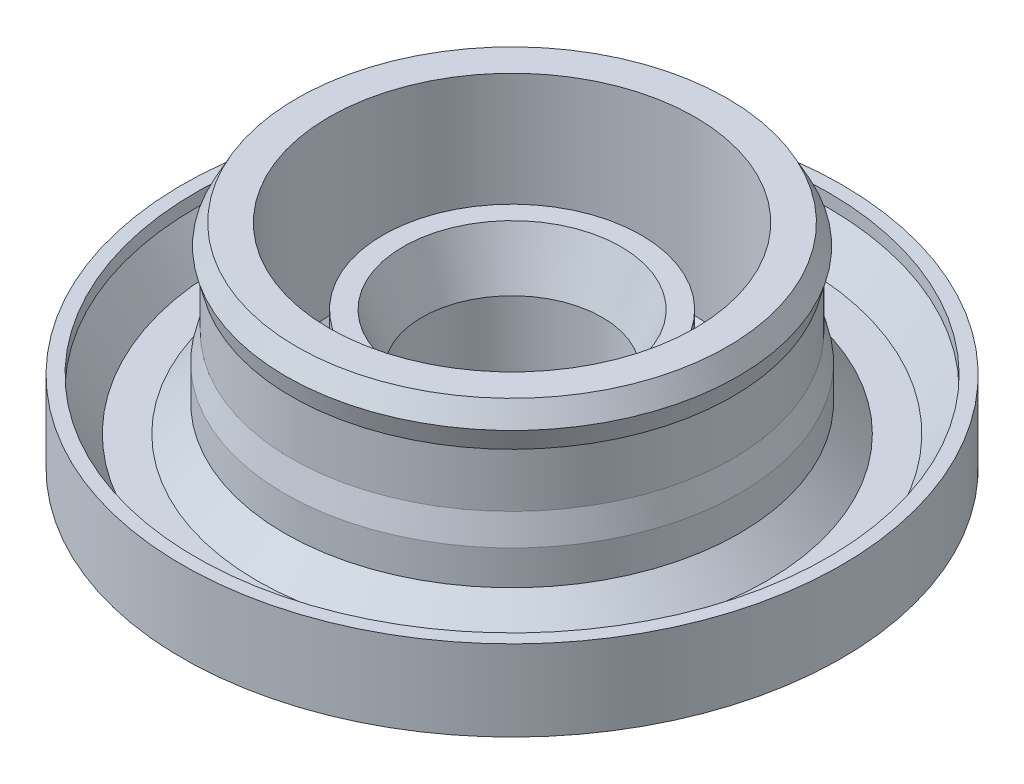
ISO-10303-21;
HEADER;
FILE_DESCRIPTION(('STEP AP214'),'2;1');
FILE_NAME('part.step','',(''),(''),'','','');
FILE_SCHEMA(('AUTOMOTIVE_DESIGN { 1 0 10303 214 1 1 1 1 }'));
ENDSEC;
DATA;
#1=APPLICATION_CONTEXT('core data for automotive mechanical design processes');
#2=APPLICATION_PROTOCOL_DEFINITION('international standard','automotive_design',2000,#1);
#3=PRODUCT_CONTEXT('',#1,'mechanical');
#4=PRODUCT('Part','Part','',(#3));
#5=PRODUCT_RELATED_PRODUCT_CATEGORY('part','',(#4));
#6=PRODUCT_DEFINITION_FORMATION('','',#4);
#7=PRODUCT_DEFINITION_CONTEXT('part definition',#1,'design');
#8=PRODUCT_DEFINITION('design','',#6,#7);
#9=PRODUCT_DEFINITION_SHAPE('','',#8);
#10=(LENGTH_UNIT() NAMED_UNIT(*) SI_UNIT(.MILLI.,.METRE.));
#11=(NAMED_UNIT(*) PLANE_ANGLE_UNIT() SI_UNIT($,.RADIAN.));
#12=(NAMED_UNIT(*) SI_UNIT($,.STERADIAN.) SOLID_ANGLE_UNIT());
#13=UNCERTAINTY_MEASURE_WITH_UNIT(LENGTH_MEASURE(1.E-05),#10,'distance_accuracy_value','');
#14=(GEOMETRIC_REPRESENTATION_CONTEXT(3) GLOBAL_UNCERTAINTY_ASSIGNED_CONTEXT((#13)) GLOBAL_UNIT_ASSIGNED_CONTEXT((#10,
#11,#12)) REPRESENTATION_CONTEXT('',''));
#15=CARTESIAN_POINT('',(0.,0.,0.));
#16=DIRECTION('',(0.,0.,1.));
#17=DIRECTION('',(1.,0.,0.));
#18=AXIS2_PLACEMENT_3D('',#15,#16,#17);
#19=CARTESIAN_POINT('',(-6.8,4.8,0.));
#20=DIRECTION('',(0.,1.,0.));
#21=DIRECTION('',(0.,0.,1.));
#22=AXIS2_PLACEMENT_3D('',#19,#20,#21);
#23=PLANE('',#22);
#24=CARTESIAN_POINT('',(0.,4.8,0.));
#25=DIRECTION('',(0.,1.,0.));
#26=DIRECTION('',(0.,0.,1.));
#27=AXIS2_PLACEMENT_3D('',#24,#25,#26);
#28=CIRCLE('',#27,4.8);
#29=CARTESIAN_POINT('',(0.,4.8,4.8));
#30=VERTEX_POINT('',#29);
#31=EDGE_CURVE('E63',#30,#30,#28,.F.);
#32=ORIENTED_EDGE('',*,*,#31,.T.);
#33=EDGE_LOOP('',(#32));
#34=FACE_BOUND('',#33,.T.);
#35=CARTESIAN_POINT('',(0.,4.8,0.));
#36=DIRECTION('',(0.,-1.,0.));
#37=DIRECTION('',(0.,0.,-1.));
#38=AXIS2_PLACEMENT_3D('',#35,#36,#37);
#39=CIRCLE('',#38,6.);
#40=CARTESIAN_POINT('',(0.,4.8,-6.));
#41=VERTEX_POINT('',#40);
#42=EDGE_CURVE('E122',#41,#41,#39,.T.);
#43=ORIENTED_EDGE('',*,*,#42,.F.);
#44=EDGE_LOOP('',(#43));
#45=FACE_BOUND('',#44,.T.);
#46=ADVANCED_FACE('F33',(#34,#45),#23,.T.);
#47=CARTESIAN_POINT('',(0.,4.8,0.));
#48=DIRECTION('',(0.,-1.,0.));
#49=DIRECTION('',(0.,0.,-1.));
#50=AXIS2_PLACEMENT_3D('',#47,#48,#49);
#51=CYLINDRICAL_SURFACE('',#50,6.8);
#52=CARTESIAN_POINT('',(0.,12.,0.));
#53=DIRECTION('',(0.,-1.,0.));
#54=DIRECTION('',(0.,0.,-1.));
#55=AXIS2_PLACEMENT_3D('',#52,#53,#54);
#56=CIRCLE('',#55,6.8);
#57=CARTESIAN_POINT('',(0.,12.,-6.8));
#58=VERTEX_POINT('',#57);
#59=EDGE_CURVE('E116',#58,#58,#56,.T.);
#60=ORIENTED_EDGE('',*,*,#59,.F.);
#61=EDGE_LOOP('',(#60));
#62=FACE_BOUND('',#61,.T.);
#63=CARTESIAN_POINT('',(0.,5.6,0.));
#64=DIRECTION('',(0.,-1.,0.));
#65=DIRECTION('',(0.,0.,-1.));
#66=AXIS2_PLACEMENT_3D('',#63,#64,#65);
#67=CIRCLE('',#66,6.8);
#68=CARTESIAN_POINT('',(0.,5.6,-6.8));
#69=VERTEX_POINT('',#68);
#70=EDGE_CURVE('E119',#69,#69,#67,.T.);
#71=ORIENTED_EDGE('',*,*,#70,.T.);
#72=EDGE_LOOP('',(#71));
#73=FACE_BOUND('',#72,.T.);
#74=ADVANCED_FACE('F129',(#62,#73),#51,.F.);
#75=CARTESIAN_POINT('',(-4.8,4.1,0.));
#76=DIRECTION('',(0.,1.,0.));
#77=DIRECTION('',(0.,0.,1.));
#78=AXIS2_PLACEMENT_3D('',#75,#76,#77);
#79=PLANE('',#78);
#80=CARTESIAN_POINT('',(0.,4.1,0.));
#81=DIRECTION('',(0.,1.,0.));
#82=DIRECTION('',(0.,0.,1.));
#83=AXIS2_PLACEMENT_3D('',#80,#81,#82);
#84=CIRCLE('',#83,4.45);
#85=CARTESIAN_POINT('',(0.,4.1,4.45));
#86=VERTEX_POINT('',#85);
#87=EDGE_CURVE('E59',#86,#86,#84,.F.);
#88=ORIENTED_EDGE('',*,*,#87,.T.);
#89=EDGE_LOOP('',(#88));
#90=FACE_BOUND('',#89,.T.);
#91=CARTESIAN_POINT('',(0.,4.1,0.));
#92=DIRECTION('',(0.,1.,0.));
#93=DIRECTION('',(0.,0.,1.));
#94=AXIS2_PLACEMENT_3D('',#91,#92,#93);
#95=CIRCLE('',#94,3.85);
#96=CARTESIAN_POINT('',(0.,4.1,3.85));
#97=VERTEX_POINT('',#96);
#98=EDGE_CURVE('E56',#97,#97,#95,.F.);
#99=ORIENTED_EDGE('',*,*,#98,.F.);
#100=EDGE_LOOP('',(#99));
#101=FACE_BOUND('',#100,.T.);
#102=ADVANCED_FACE('F135',(#90,#101),#79,.F.);
#103=CARTESIAN_POINT('',(0.,0.,0.));
#104=DIRECTION('',(0.,-1.,0.));
#105=DIRECTION('',(0.,0.,-1.));
#106=AXIS2_PLACEMENT_3D('',#103,#104,#105);
#107=CYLINDRICAL_SURFACE('',#106,4.45);
#108=CARTESIAN_POINT('',(0.,0.,0.));
#109=DIRECTION('',(0.,-1.,0.));
#110=DIRECTION('',(0.,0.,-1.));
#111=AXIS2_PLACEMENT_3D('',#108,#109,#110);
#112=CIRCLE('',#111,4.45);
#113=CARTESIAN_POINT('',(0.,0.,-4.45));
#114=VERTEX_POINT('',#113);
#115=EDGE_CURVE('E75',#114,#114,#112,.T.);
#116=ORIENTED_EDGE('',*,*,#115,.T.);
#117=EDGE_LOOP('',(#116));
#118=FACE_BOUND('',#117,.T.);
#119=ORIENTED_EDGE('',*,*,#87,.F.);
#120=EDGE_LOOP('',(#119));
#121=FACE_BOUND('',#120,.T.);
#122=ADVANCED_FACE('F167',(#118,#121),#107,.F.);
#123=CARTESIAN_POINT('',(0.,0.,0.));
#124=DIRECTION('',(0.,-1.,0.));
#125=DIRECTION('',(0.,0.,-1.));
#126=AXIS2_PLACEMENT_3D('',#123,#124,#125);
#127=CYLINDRICAL_SURFACE('',#126,12.25);
#128=CARTESIAN_POINT('',(0.,4.1,0.));
#129=DIRECTION('',(0.,-1.,0.));
#130=DIRECTION('',(0.,0.,-1.));
#131=AXIS2_PLACEMENT_3D('',#128,#129,#130);
#132=CIRCLE('',#131,12.25);
#133=CARTESIAN_POINT('',(0.,4.1,-12.25));
#134=VERTEX_POINT('',#133);
#135=EDGE_CURVE('E71',#134,#134,#132,.T.);
#136=ORIENTED_EDGE('',*,*,#135,.F.);
#137=EDGE_LOOP('',(#136));
#138=FACE_BOUND('',#137,.T.);
#139=CARTESIAN_POINT('',(0.,7.1,0.));
#140=DIRECTION('',(0.,-1.,0.));
#141=DIRECTION('',(0.,0.,-1.));
#142=AXIS2_PLACEMENT_3D('',#139,#140,#141);
#143=CIRCLE('',#142,12.25);
#144=CARTESIAN_POINT('',(0.,7.1,-12.25));
#145=VERTEX_POINT('',#144);
#146=EDGE_CURVE('E62',#145,#145,#143,.T.);
#147=ORIENTED_EDGE('',*,*,#146,.T.);
#148=EDGE_LOOP('',(#147));
#149=FACE_BOUND('',#148,.T.);
#150=ADVANCED_FACE('F170',(#138,#149),#127,.T.);
#151=CARTESIAN_POINT('',(-12.25,7.1,0.));
#152=DIRECTION('',(0.,-1.,0.));
#153=DIRECTION('',(0.,0.,-1.));
#154=AXIS2_PLACEMENT_3D('',#151,#152,#153);
#155=PLANE('',#154);
#156=CARTESIAN_POINT('',(0.,7.1,0.));
#157=DIRECTION('',(0.,-1.,0.));
#158=DIRECTION('',(0.,0.,-1.));
#159=AXIS2_PLACEMENT_3D('',#156,#157,#158);
#160=CIRCLE('',#159,11.75);
#161=CARTESIAN_POINT('',(0.,7.1,-11.75));
#162=VERTEX_POINT('',#161);
#163=EDGE_CURVE('E68',#162,#162,#160,.F.);
#164=ORIENTED_EDGE('',*,*,#163,.F.);
#165=EDGE_LOOP('',(#164));
#166=FACE_BOUND('',#165,.T.);
#167=ORIENTED_EDGE('',*,*,#146,.F.);
#168=EDGE_LOOP('',(#167));
#169=FACE_BOUND('',#168,.T.);
#170=ADVANCED_FACE('F165',(#166,#169),#155,.F.);
#171=CARTESIAN_POINT('',(-4.45,0.,0.));
#172=DIRECTION('',(0.,1.,0.));
#173=DIRECTION('',(0.,0.,1.));
#174=AXIS2_PLACEMENT_3D('',#171,#172,#173);
#175=PLANE('',#174);
#176=CARTESIAN_POINT('',(0.,0.,0.));
#177=DIRECTION('',(0.,1.,0.));
#178=DIRECTION('',(0.,0.,1.));
#179=AXIS2_PLACEMENT_3D('',#176,#177,#178);
#180=CIRCLE('',#179,5.5);
#181=CARTESIAN_POINT('',(0.,0.,5.5));
#182=VERTEX_POINT('',#181);
#183=EDGE_CURVE('E48',#182,#182,#180,.F.);
#184=ORIENTED_EDGE('',*,*,#183,.T.);
#185=EDGE_LOOP('',(#184));
#186=FACE_BOUND('',#185,.T.);
#187=ORIENTED_EDGE('',*,*,#115,.F.);
#188=EDGE_LOOP('',(#187));
#189=FACE_BOUND('',#188,.T.);
#190=ADVANCED_FACE('F161',(#186,#189),#175,.F.);
#191=CARTESIAN_POINT('',(0.,0.,0.));
#192=DIRECTION('',(0.,-1.,0.));
#193=DIRECTION('',(0.,0.,-1.));
#194=AXIS2_PLACEMENT_3D('',#191,#192,#193);
#195=CYLINDRICAL_SURFACE('',#194,6.);
#196=CARTESIAN_POINT('',(0.,0.5,0.));
#197=DIRECTION('',(0.,1.,0.));
#198=DIRECTION('',(0.,0.,1.));
#199=AXIS2_PLACEMENT_3D('',#196,#197,#198);
#200=CIRCLE('',#199,6.);
#201=CARTESIAN_POINT('',(0.,0.5,6.));
#202=VERTEX_POINT('',#201);
#203=EDGE_CURVE('E44',#202,#202,#200,.T.);
#204=ORIENTED_EDGE('',*,*,#203,.T.);
#205=EDGE_LOOP('',(#204));
#206=FACE_BOUND('',#205,.T.);
#207=CARTESIAN_POINT('',(0.,4.1,0.));
#208=DIRECTION('',(0.,-1.,0.));
#209=DIRECTION('',(0.,0.,-1.));
#210=AXIS2_PLACEMENT_3D('',#207,#208,#209);
#211=CIRCLE('',#210,6.);
#212=CARTESIAN_POINT('',(0.,4.1,-6.));
#213=VERTEX_POINT('',#212);
#214=EDGE_CURVE('E78',#213,#213,#211,.T.);
#215=ORIENTED_EDGE('',*,*,#214,.T.);
#216=EDGE_LOOP('',(#215));
#217=FACE_BOUND('',#216,.T.);
#218=ADVANCED_FACE('F157',(#206,#217),#195,.T.);
#219=CARTESIAN_POINT('',(-6.,4.1,0.));
#220=DIRECTION('',(0.,1.,0.));
#221=DIRECTION('',(0.,0.,1.));
#222=AXIS2_PLACEMENT_3D('',#219,#220,#221);
#223=PLANE('',#222);
#224=ORIENTED_EDGE('',*,*,#214,.F.);
#225=EDGE_LOOP('',(#224));
#226=FACE_BOUND('',#225,.T.);
#227=ORIENTED_EDGE('',*,*,#135,.T.);
#228=EDGE_LOOP('',(#227));
#229=FACE_BOUND('',#228,.T.);
#230=ADVANCED_FACE('F153',(#226,#229),#223,.F.);
#231=CARTESIAN_POINT('',(0.,4.8,0.));
#232=DIRECTION('',(0.,-1.,0.));
#233=DIRECTION('',(0.,0.,-1.));
#234=AXIS2_PLACEMENT_3D('',#231,#232,#233);
#235=CYLINDRICAL_SURFACE('',#234,11.75);
#236=CARTESIAN_POINT('',(0.,6.6,0.));
#237=DIRECTION('',(0.,-1.,0.));
#238=DIRECTION('',(0.,0.,-1.));
#239=AXIS2_PLACEMENT_3D('',#236,#237,#238);
#240=CIRCLE('',#239,11.75);
#241=CARTESIAN_POINT('',(0.,6.6,-11.75));
#242=VERTEX_POINT('',#241);
#243=EDGE_CURVE('E72',#242,#242,#240,.T.);
#244=ORIENTED_EDGE('',*,*,#243,.T.);
#245=EDGE_LOOP('',(#244));
#246=FACE_BOUND('',#245,.T.);
#247=ORIENTED_EDGE('',*,*,#163,.T.);
#248=EDGE_LOOP('',(#247));
#249=FACE_BOUND('',#248,.T.);
#250=ADVANCED_FACE('F149',(#246,#249),#235,.F.);
#251=CARTESIAN_POINT('',(0.,6.6,0.));
#252=DIRECTION('',(0.,1.,0.));
#253=DIRECTION('',(0.,0.,1.));
#254=AXIS2_PLACEMENT_3D('',#251,#252,#253);
#255=CONICAL_SURFACE('',#254,11.75,0.61086523819801);
#256=CARTESIAN_POINT('',(0.,5.2,0.));
#257=DIRECTION('',(0.,-1.,0.));
#258=DIRECTION('',(0.,0.,-1.));
#259=AXIS2_PLACEMENT_3D('',#256,#257,#258);
#260=CIRCLE('',#259,10.7697094465064);
#261=CARTESIAN_POINT('',(0.,5.2,-10.7697094465064));
#262=VERTEX_POINT('',#261);
#263=EDGE_CURVE('E66',#262,#262,#260,.T.);
#264=ORIENTED_EDGE('',*,*,#263,.T.);
#265=EDGE_LOOP('',(#264));
#266=FACE_BOUND('',#265,.T.);
#267=ORIENTED_EDGE('',*,*,#243,.F.);
#268=EDGE_LOOP('',(#267));
#269=FACE_BOUND('',#268,.T.);
#270=ADVANCED_FACE('F145',(#266,#269),#255,.F.);
#271=CARTESIAN_POINT('',(-10.7697094465064,5.2,0.));
#272=DIRECTION('',(0.,1.,0.));
#273=DIRECTION('',(0.,0.,1.));
#274=AXIS2_PLACEMENT_3D('',#271,#272,#273);
#275=PLANE('',#274);
#276=CARTESIAN_POINT('',(0.,5.2,0.));
#277=DIRECTION('',(0.,1.,0.));
#278=DIRECTION('',(0.,0.,1.));
#279=AXIS2_PLACEMENT_3D('',#276,#277,#278);
#280=CIRCLE('',#279,9.46970944650642);
#281=CARTESIAN_POINT('',(0.,5.2,9.46970944650642));
#282=VERTEX_POINT('',#281);
#283=EDGE_CURVE('E53',#282,#282,#280,.T.);
#284=ORIENTED_EDGE('',*,*,#283,.F.);
#285=EDGE_LOOP('',(#284));
#286=FACE_BOUND('',#285,.T.);
#287=ORIENTED_EDGE('',*,*,#263,.F.);
#288=EDGE_LOOP('',(#287));
#289=FACE_BOUND('',#288,.T.);
#290=ADVANCED_FACE('F142',(#286,#289),#275,.T.);
#291=CARTESIAN_POINT('',(-4.05,9.2,0.));
#292=DIRECTION('',(0.,-1.,0.));
#293=DIRECTION('',(0.,0.,-1.));
#294=AXIS2_PLACEMENT_3D('',#291,#292,#293);
#295=PLANE('',#294);
#296=CARTESIAN_POINT('',(0.,9.2,0.));
#297=DIRECTION('',(0.,-1.,0.));
#298=DIRECTION('',(0.,0.,-1.));
#299=AXIS2_PLACEMENT_3D('',#296,#297,#298);
#300=CIRCLE('',#299,4.8);
#301=CARTESIAN_POINT('',(0.,9.2,-4.8));
#302=VERTEX_POINT('',#301);
#303=EDGE_CURVE('E67',#302,#302,#300,.T.);
#304=ORIENTED_EDGE('',*,*,#303,.F.);
#305=EDGE_LOOP('',(#304));
#306=FACE_BOUND('',#305,.T.);
#307=CARTESIAN_POINT('',(0.,9.2,0.));
#308=DIRECTION('',(0.,-1.,0.));
#309=DIRECTION('',(0.,0.,-1.));
#310=AXIS2_PLACEMENT_3D('',#307,#308,#309);
#311=CIRCLE('',#310,4.05);
#312=CARTESIAN_POINT('',(0.,9.2,-4.05));
#313=VERTEX_POINT('',#312);
#314=EDGE_CURVE('E92',#313,#313,#311,.T.);
#315=ORIENTED_EDGE('',*,*,#314,.T.);
#316=EDGE_LOOP('',(#315));
#317=FACE_BOUND('',#316,.T.);
#318=ADVANCED_FACE('F139',(#306,#317),#295,.F.);
#319=CARTESIAN_POINT('',(0.,0.,0.));
#320=DIRECTION('',(0.,-1.,0.));
#321=DIRECTION('',(0.,0.,-1.));
#322=AXIS2_PLACEMENT_3D('',#319,#320,#321);
#323=CYLINDRICAL_SURFACE('',#322,4.8);
#324=ORIENTED_EDGE('',*,*,#31,.F.);
#325=EDGE_LOOP('',(#324));
#326=FACE_BOUND('',#325,.T.);
#327=ORIENTED_EDGE('',*,*,#303,.T.);
#328=EDGE_LOOP('',(#327));
#329=FACE_BOUND('',#328,.T.);
#330=ADVANCED_FACE('F221',(#326,#329),#323,.T.);
#331=CARTESIAN_POINT('',(0.,0.,0.));
#332=DIRECTION('',(0.,-1.,0.));
#333=DIRECTION('',(0.,0.,-1.));
#334=AXIS2_PLACEMENT_3D('',#331,#332,#333);
#335=CYLINDRICAL_SURFACE('',#334,3.35);
#336=CARTESIAN_POINT('',(0.,7.27676580638177,0.));
#337=DIRECTION('',(0.,-1.,0.));
#338=DIRECTION('',(0.,0.,-1.));
#339=AXIS2_PLACEMENT_3D('',#336,#337,#338);
#340=CIRCLE('',#339,3.35);
#341=CARTESIAN_POINT('',(0.,7.27676580638177,-3.35));
#342=VERTEX_POINT('',#341);
#343=EDGE_CURVE('E89',#342,#342,#340,.T.);
#344=ORIENTED_EDGE('',*,*,#343,.F.);
#345=EDGE_LOOP('',(#344));
#346=FACE_BOUND('',#345,.T.);
#347=CARTESIAN_POINT('',(0.,2.,0.));
#348=DIRECTION('',(0.,-1.,0.));
#349=DIRECTION('',(0.,0.,-1.));
#350=AXIS2_PLACEMENT_3D('',#347,#348,#349);
#351=CIRCLE('',#350,3.35);
#352=CARTESIAN_POINT('',(0.,2.,-3.35));
#353=VERTEX_POINT('',#352);
#354=EDGE_CURVE('E95',#353,#353,#351,.T.);
#355=ORIENTED_EDGE('',*,*,#354,.T.);
#356=EDGE_LOOP('',(#355));
#357=FACE_BOUND('',#356,.T.);
#358=ADVANCED_FACE('F218',(#346,#357),#335,.F.);
#359=CARTESIAN_POINT('',(0.,7.27676580638177,0.));
#360=DIRECTION('',(0.,1.,0.));
#361=DIRECTION('',(0.,0.,1.));
#362=AXIS2_PLACEMENT_3D('',#359,#360,#361);
#363=CONICAL_SURFACE('',#362,3.35,0.349065850398867);
#364=ORIENTED_EDGE('',*,*,#314,.F.);
#365=EDGE_LOOP('',(#364));
#366=FACE_BOUND('',#365,.T.);
#367=ORIENTED_EDGE('',*,*,#343,.T.);
#368=EDGE_LOOP('',(#367));
#369=FACE_BOUND('',#368,.T.);
#370=ADVANCED_FACE('F213',(#366,#369),#363,.F.);
#371=CARTESIAN_POINT('',(0.,2.,0.));
#372=DIRECTION('',(0.,-1.,0.));
#373=DIRECTION('',(0.,0.,-1.));
#374=AXIS2_PLACEMENT_3D('',#371,#372,#373);
#375=PLANE('',#374);
#376=CARTESIAN_POINT('',(0.,2.,0.));
#377=DIRECTION('',(0.,-1.,0.));
#378=DIRECTION('',(0.,0.,-1.));
#379=AXIS2_PLACEMENT_3D('',#376,#377,#378);
#380=CIRCLE('',#379,3.65);
#381=CARTESIAN_POINT('',(0.,2.,-3.65));
#382=VERTEX_POINT('',#381);
#383=EDGE_CURVE('E40',#382,#382,#380,.T.);
#384=ORIENTED_EDGE('',*,*,#383,.T.);
#385=EDGE_LOOP('',(#384));
#386=FACE_BOUND('',#385,.T.);
#387=ORIENTED_EDGE('',*,*,#354,.F.);
#388=EDGE_LOOP('',(#387));
#389=FACE_BOUND('',#388,.T.);
#390=ADVANCED_FACE('F204',(#386,#389),#375,.T.);
#391=CARTESIAN_POINT('',(0.,2.,0.));
#392=DIRECTION('',(0.,1.,0.));
#393=DIRECTION('',(0.,0.,1.));
#394=AXIS2_PLACEMENT_3D('',#391,#392,#393);
#395=CYLINDRICAL_SURFACE('',#394,3.85);
#396=CARTESIAN_POINT('',(0.,2.2,0.));
#397=DIRECTION('',(0.,-1.,0.));
#398=DIRECTION('',(0.,0.,-1.));
#399=AXIS2_PLACEMENT_3D('',#396,#397,#398);
#400=CIRCLE('',#399,3.85);
#401=CARTESIAN_POINT('',(0.,2.2,-3.85));
#402=VERTEX_POINT('',#401);
#403=EDGE_CURVE('E10',#402,#402,#400,.F.);
#404=ORIENTED_EDGE('',*,*,#403,.T.);
#405=EDGE_LOOP('',(#404));
#406=FACE_BOUND('',#405,.T.);
#407=ORIENTED_EDGE('',*,*,#98,.T.);
#408=EDGE_LOOP('',(#407));
#409=FACE_BOUND('',#408,.T.);
#410=ADVANCED_FACE('F201',(#406,#409),#395,.T.);
#411=CARTESIAN_POINT('',(0.,12.,0.));
#412=DIRECTION('',(0.,1.,0.));
#413=DIRECTION('',(0.,0.,1.));
#414=AXIS2_PLACEMENT_3D('',#411,#412,#413);
#415=PLANE('',#414);
#416=ORIENTED_EDGE('',*,*,#59,.T.);
#417=EDGE_LOOP('',(#416));
#418=FACE_BOUND('',#417,.T.);
#419=CARTESIAN_POINT('',(0.,12.,0.));
#420=DIRECTION('',(0.,-1.,0.));
#421=DIRECTION('',(0.,0.,-1.));
#422=AXIS2_PLACEMENT_3D('',#419,#420,#421);
#423=CIRCLE('',#422,8.);
#424=CARTESIAN_POINT('',(0.,12.,-8.));
#425=VERTEX_POINT('',#424);
#426=EDGE_CURVE('E98',#425,#425,#423,.T.);
#427=ORIENTED_EDGE('',*,*,#426,.F.);
#428=EDGE_LOOP('',(#427));
#429=FACE_BOUND('',#428,.T.);
#430=ADVANCED_FACE('F203',(#418,#429),#415,.T.);
#431=CARTESIAN_POINT('',(0.,11.2464101615138,0.));
#432=DIRECTION('',(0.,-1.,0.));
#433=DIRECTION('',(0.,0.,-1.));
#434=AXIS2_PLACEMENT_3D('',#431,#432,#433);
#435=CONICAL_SURFACE('',#434,8.4,0.48797725371062);
#436=ORIENTED_EDGE('',*,*,#426,.T.);
#437=EDGE_LOOP('',(#436));
#438=FACE_BOUND('',#437,.T.);
#439=CARTESIAN_POINT('',(0.,11.2464101615138,0.));
#440=DIRECTION('',(0.,-1.,0.));
#441=DIRECTION('',(0.,0.,-1.));
#442=AXIS2_PLACEMENT_3D('',#439,#440,#441);
#443=CIRCLE('',#442,8.4);
#444=CARTESIAN_POINT('',(0.,11.2464101615138,-8.4));
#445=VERTEX_POINT('',#444);
#446=EDGE_CURVE('E101',#445,#445,#443,.T.);
#447=ORIENTED_EDGE('',*,*,#446,.F.);
#448=EDGE_LOOP('',(#447));
#449=FACE_BOUND('',#448,.T.);
#450=ADVANCED_FACE('F210',(#438,#449),#435,.T.);
#451=CARTESIAN_POINT('',(0.,10.5,0.));
#452=DIRECTION('',(0.,1.,0.));
#453=DIRECTION('',(0.,0.,1.));
#454=AXIS2_PLACEMENT_3D('',#451,#452,#453);
#455=CONICAL_SURFACE('',#454,8.2,0.261799387799143);
#456=ORIENTED_EDGE('',*,*,#446,.T.);
#457=EDGE_LOOP('',(#456));
#458=FACE_BOUND('',#457,.T.);
#459=CARTESIAN_POINT('',(0.,10.5,0.));
#460=DIRECTION('',(0.,-1.,0.));
#461=DIRECTION('',(0.,0.,-1.));
#462=AXIS2_PLACEMENT_3D('',#459,#460,#461);
#463=CIRCLE('',#462,8.2);
#464=CARTESIAN_POINT('',(0.,10.5,-8.2));
#465=VERTEX_POINT('',#464);
#466=EDGE_CURVE('E104',#465,#465,#463,.T.);
#467=ORIENTED_EDGE('',*,*,#466,.F.);
#468=EDGE_LOOP('',(#467));
#469=FACE_BOUND('',#468,.T.);
#470=ADVANCED_FACE('F330',(#458,#469),#455,.T.);
#471=CARTESIAN_POINT('',(0.,0.,0.));
#472=DIRECTION('',(0.,-1.,0.));
#473=DIRECTION('',(0.,0.,-1.));
#474=AXIS2_PLACEMENT_3D('',#471,#472,#473);
#475=CYLINDRICAL_SURFACE('',#474,8.2);
#476=ORIENTED_EDGE('',*,*,#466,.T.);
#477=EDGE_LOOP('',(#476));
#478=FACE_BOUND('',#477,.T.);
#479=CARTESIAN_POINT('',(0.,8.5,0.));
#480=DIRECTION('',(0.,-1.,0.));
#481=DIRECTION('',(0.,0.,-1.));
#482=AXIS2_PLACEMENT_3D('',#479,#480,#481);
#483=CIRCLE('',#482,8.2);
#484=CARTESIAN_POINT('',(0.,8.5,-8.2));
#485=VERTEX_POINT('',#484);
#486=EDGE_CURVE('E107',#485,#485,#483,.T.);
#487=ORIENTED_EDGE('',*,*,#486,.F.);
#488=EDGE_LOOP('',(#487));
#489=FACE_BOUND('',#488,.T.);
#490=ADVANCED_FACE('F322',(#478,#489),#475,.T.);
#491=CARTESIAN_POINT('',(0.,7.5,0.));
#492=DIRECTION('',(0.,-1.,0.));
#493=DIRECTION('',(0.,0.,-1.));
#494=AXIS2_PLACEMENT_3D('',#491,#492,#493);
#495=CONICAL_SURFACE('',#494,8.45,0.244978663126864);
#496=ORIENTED_EDGE('',*,*,#486,.T.);
#497=EDGE_LOOP('',(#496));
#498=FACE_BOUND('',#497,.T.);
#499=CARTESIAN_POINT('',(0.,7.5,0.));
#500=DIRECTION('',(0.,-1.,0.));
#501=DIRECTION('',(0.,0.,-1.));
#502=AXIS2_PLACEMENT_3D('',#499,#500,#501);
#503=CIRCLE('',#502,8.45);
#504=CARTESIAN_POINT('',(0.,7.5,-8.45));
#505=VERTEX_POINT('',#504);
#506=EDGE_CURVE('E110',#505,#505,#503,.T.);
#507=ORIENTED_EDGE('',*,*,#506,.F.);
#508=EDGE_LOOP('',(#507));
#509=FACE_BOUND('',#508,.T.);
#510=ADVANCED_FACE('F314',(#498,#509),#495,.T.);
#511=CARTESIAN_POINT('',(0.,0.,0.));
#512=DIRECTION('',(0.,-1.,0.));
#513=DIRECTION('',(0.,0.,-1.));
#514=AXIS2_PLACEMENT_3D('',#511,#512,#513);
#515=CYLINDRICAL_SURFACE('',#514,8.45);
#516=ORIENTED_EDGE('',*,*,#506,.T.);
#517=EDGE_LOOP('',(#516));
#518=FACE_BOUND('',#517,.T.);
#519=CARTESIAN_POINT('',(0.,6.21970944650641,0.));
#520=DIRECTION('',(0.,-1.,0.));
#521=DIRECTION('',(0.,0.,-1.));
#522=AXIS2_PLACEMENT_3D('',#519,#520,#521);
#523=CIRCLE('',#522,8.45);
#524=CARTESIAN_POINT('',(0.,6.21970944650641,-8.45));
#525=VERTEX_POINT('',#524);
#526=EDGE_CURVE('E113',#525,#525,#523,.T.);
#527=ORIENTED_EDGE('',*,*,#526,.F.);
#528=EDGE_LOOP('',(#527));
#529=FACE_BOUND('',#528,.T.);
#530=ADVANCED_FACE('F306',(#518,#529),#515,.T.);
#531=CARTESIAN_POINT('',(0.,5.2,0.));
#532=DIRECTION('',(0.,-1.,0.));
#533=DIRECTION('',(0.,0.,-1.));
#534=AXIS2_PLACEMENT_3D('',#531,#532,#533);
#535=CONICAL_SURFACE('',#534,9.46970944650642,0.785398163397453);
#536=ORIENTED_EDGE('',*,*,#526,.T.);
#537=EDGE_LOOP('',(#536));
#538=FACE_BOUND('',#537,.T.);
#539=ORIENTED_EDGE('',*,*,#283,.T.);
#540=EDGE_LOOP('',(#539));
#541=FACE_BOUND('',#540,.T.);
#542=ADVANCED_FACE('F185',(#538,#541),#535,.T.);
#543=CARTESIAN_POINT('',(0.,4.8,0.));
#544=DIRECTION('',(0.,1.,0.));
#545=DIRECTION('',(0.,0.,1.));
#546=AXIS2_PLACEMENT_3D('',#543,#544,#545);
#547=CONICAL_SURFACE('',#546,6.,0.785398163397447);
#548=ORIENTED_EDGE('',*,*,#70,.F.);
#549=EDGE_LOOP('',(#548));
#550=FACE_BOUND('',#549,.T.);
#551=ORIENTED_EDGE('',*,*,#42,.T.);
#552=EDGE_LOOP('',(#551));
#553=FACE_BOUND('',#552,.T.);
#554=ADVANCED_FACE('F126',(#550,#553),#547,.F.);
#555=CARTESIAN_POINT('',(0.,0.5,0.));
#556=DIRECTION('',(0.,1.,0.));
#557=DIRECTION('',(0.,0.,1.));
#558=AXIS2_PLACEMENT_3D('',#555,#556,#557);
#559=TOROIDAL_SURFACE('',#558,5.5,0.5);
#560=ORIENTED_EDGE('',*,*,#203,.F.);
#561=EDGE_LOOP('',(#560));
#562=FACE_BOUND('',#561,.T.);
#563=ORIENTED_EDGE('',*,*,#183,.F.);
#564=EDGE_LOOP('',(#563));
#565=FACE_BOUND('',#564,.T.);
#566=ADVANCED_FACE('F177',(#562,#565),#559,.T.);
#567=CARTESIAN_POINT('',(0.,2.2,0.));
#568=DIRECTION('',(0.,-1.,0.));
#569=DIRECTION('',(0.,0.,-1.));
#570=AXIS2_PLACEMENT_3D('',#567,#568,#569);
#571=TOROIDAL_SURFACE('',#570,3.65,0.2);
#572=ORIENTED_EDGE('',*,*,#403,.F.);
#573=EDGE_LOOP('',(#572));
#574=FACE_BOUND('',#573,.T.);
#575=ORIENTED_EDGE('',*,*,#383,.F.);
#576=EDGE_LOOP('',(#575));
#577=FACE_BOUND('',#576,.T.);
#578=ADVANCED_FACE('F35',(#574,#577),#571,.T.);
#579=CLOSED_SHELL('',(#46,#74,#102,#122,#150,#170,#190,#218,#230,#250,#270,#290,#318,#330,#358,
#370,#390,#410,#430,#450,#470,#490,#510,#530,#542,#554,#566,#578));
#580=MANIFOLD_SOLID_BREP('B2',#579);
#581=ADVANCED_BREP_SHAPE_REPRESENTATION('',(#18,#580),#14);
#582=SHAPE_DEFINITION_REPRESENTATION(#9,#581);
ENDSEC;
END-ISO-10303-21;
